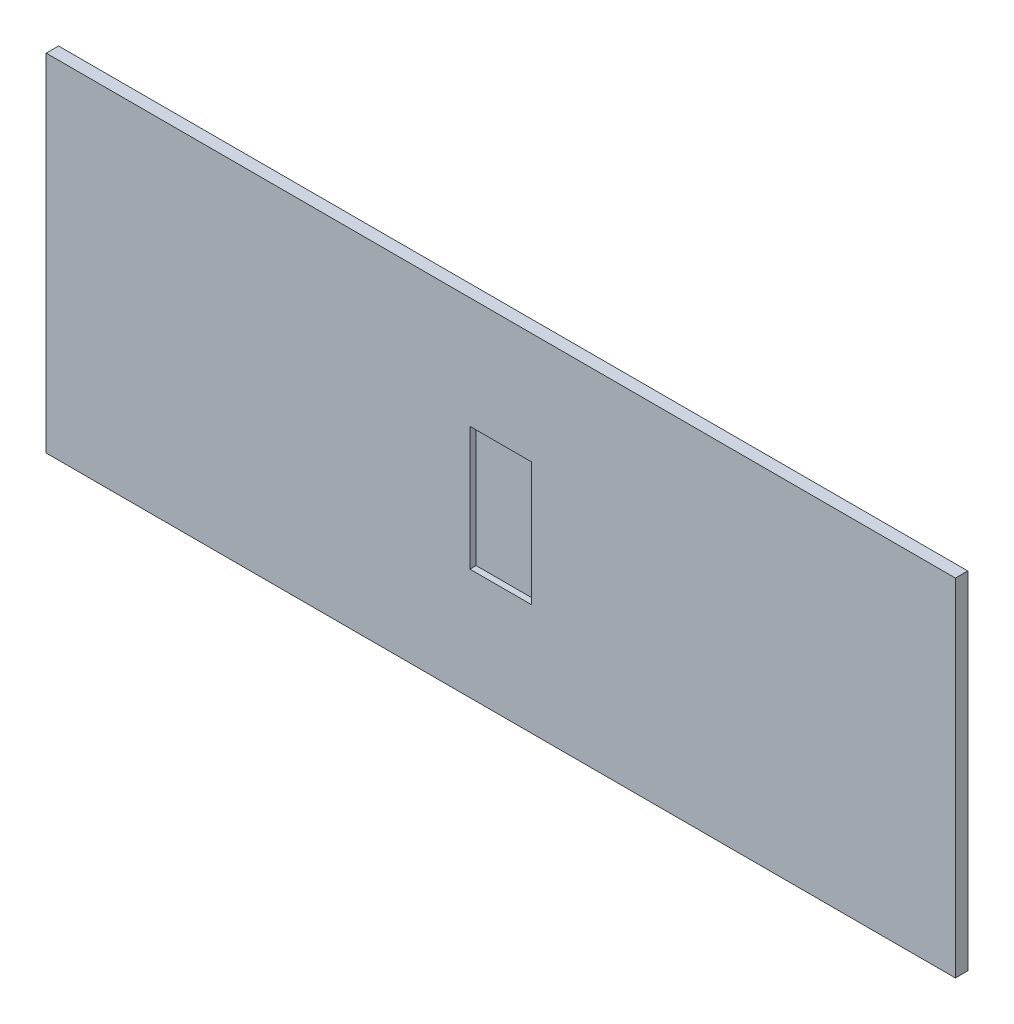
ISO-10303-21;
HEADER;
FILE_DESCRIPTION(('STEP AP214'),'2;1');
FILE_NAME('part.step','',(''),(''),'','','');
FILE_SCHEMA(('AUTOMOTIVE_DESIGN { 1 0 10303 214 1 1 1 1 }'));
ENDSEC;
DATA;
#1=APPLICATION_CONTEXT('core data for automotive mechanical design processes');
#2=APPLICATION_PROTOCOL_DEFINITION('international standard','automotive_design',2000,#1);
#3=PRODUCT_CONTEXT('',#1,'mechanical');
#4=PRODUCT('Part','Part','',(#3));
#5=PRODUCT_RELATED_PRODUCT_CATEGORY('part','',(#4));
#6=PRODUCT_DEFINITION_FORMATION('','',#4);
#7=PRODUCT_DEFINITION_CONTEXT('part definition',#1,'design');
#8=PRODUCT_DEFINITION('design','',#6,#7);
#9=PRODUCT_DEFINITION_SHAPE('','',#8);
#10=(LENGTH_UNIT() NAMED_UNIT(*) SI_UNIT(.MILLI.,.METRE.));
#11=(NAMED_UNIT(*) PLANE_ANGLE_UNIT() SI_UNIT($,.RADIAN.));
#12=(NAMED_UNIT(*) SI_UNIT($,.STERADIAN.) SOLID_ANGLE_UNIT());
#13=UNCERTAINTY_MEASURE_WITH_UNIT(LENGTH_MEASURE(1.E-05),#10,'distance_accuracy_value','');
#14=(GEOMETRIC_REPRESENTATION_CONTEXT(3) GLOBAL_UNCERTAINTY_ASSIGNED_CONTEXT((#13)) GLOBAL_UNIT_ASSIGNED_CONTEXT((#10,
#11,#12)) REPRESENTATION_CONTEXT('',''));
#15=CARTESIAN_POINT('',(0.,0.,0.));
#16=DIRECTION('',(0.,0.,1.));
#17=DIRECTION('',(1.,0.,0.));
#18=AXIS2_PLACEMENT_3D('',#15,#16,#17);
#19=CARTESIAN_POINT('',(73.5,-28.,1.));
#20=DIRECTION('',(-1.,0.,0.));
#21=DIRECTION('',(0.,0.,1.));
#22=AXIS2_PLACEMENT_3D('',#19,#20,#21);
#23=PLANE('',#22);
#24=DIRECTION('',(0.,1.,0.));
#25=VECTOR('',#24,1.);
#26=CARTESIAN_POINT('',(73.5,-28.,-1.));
#27=LINE('',#26,#25);
#28=CARTESIAN_POINT('',(73.5,-28.,-1.));
#29=VERTEX_POINT('',#28);
#30=CARTESIAN_POINT('',(73.5,28.,-1.));
#31=VERTEX_POINT('',#30);
#32=EDGE_CURVE('E162',#29,#31,#27,.T.);
#33=ORIENTED_EDGE('',*,*,#32,.T.);
#34=DIRECTION('',(0.,0.,-1.));
#35=VECTOR('',#34,1.);
#36=CARTESIAN_POINT('',(73.5,28.,1.));
#37=LINE('',#36,#35);
#38=CARTESIAN_POINT('',(73.5,28.,1.));
#39=VERTEX_POINT('',#38);
#40=EDGE_CURVE('E11',#39,#31,#37,.T.);
#41=ORIENTED_EDGE('',*,*,#40,.F.);
#42=DIRECTION('',(0.,1.,0.));
#43=VECTOR('',#42,1.);
#44=CARTESIAN_POINT('',(73.5,-28.,1.));
#45=LINE('',#44,#43);
#46=CARTESIAN_POINT('',(73.5,-28.,1.));
#47=VERTEX_POINT('',#46);
#48=EDGE_CURVE('E168',#47,#39,#45,.T.);
#49=ORIENTED_EDGE('',*,*,#48,.F.);
#50=DIRECTION('',(0.,0.,-1.));
#51=VECTOR('',#50,1.);
#52=CARTESIAN_POINT('',(73.5,-28.,1.));
#53=LINE('',#52,#51);
#54=EDGE_CURVE('E178',#47,#29,#53,.T.);
#55=ORIENTED_EDGE('',*,*,#54,.T.);
#56=EDGE_LOOP('',(#33,#41,#49,#55));
#57=FACE_BOUND('',#56,.T.);
#58=ADVANCED_FACE('F43',(#57),#23,.F.);
#59=CARTESIAN_POINT('',(-73.5,28.,1.));
#60=DIRECTION('',(0.,-1.,0.));
#61=DIRECTION('',(0.,0.,-1.));
#62=AXIS2_PLACEMENT_3D('',#59,#60,#61);
#63=PLANE('',#62);
#64=DIRECTION('',(-1.,0.,0.));
#65=VECTOR('',#64,1.);
#66=CARTESIAN_POINT('',(-73.5,28.,-1.));
#67=LINE('',#66,#65);
#68=CARTESIAN_POINT('',(-73.5,28.,-1.));
#69=VERTEX_POINT('',#68);
#70=EDGE_CURVE('E182',#31,#69,#67,.T.);
#71=ORIENTED_EDGE('',*,*,#70,.T.);
#72=DIRECTION('',(0.,0.,-1.));
#73=VECTOR('',#72,1.);
#74=CARTESIAN_POINT('',(-73.5,28.,1.));
#75=LINE('',#74,#73);
#76=CARTESIAN_POINT('',(-73.5,28.,1.));
#77=VERTEX_POINT('',#76);
#78=EDGE_CURVE('E51',#77,#69,#75,.T.);
#79=ORIENTED_EDGE('',*,*,#78,.F.);
#80=DIRECTION('',(-1.,0.,0.));
#81=VECTOR('',#80,1.);
#82=CARTESIAN_POINT('',(-73.5,28.,1.));
#83=LINE('',#82,#81);
#84=EDGE_CURVE('E95',#39,#77,#83,.T.);
#85=ORIENTED_EDGE('',*,*,#84,.F.);
#86=ORIENTED_EDGE('',*,*,#40,.T.);
#87=EDGE_LOOP('',(#71,#79,#85,#86));
#88=FACE_BOUND('',#87,.T.);
#89=ADVANCED_FACE('F217',(#88),#63,.F.);
#90=CARTESIAN_POINT('',(-73.5,-28.,1.));
#91=DIRECTION('',(1.,0.,0.));
#92=DIRECTION('',(0.,0.,-1.));
#93=AXIS2_PLACEMENT_3D('',#90,#91,#92);
#94=PLANE('',#93);
#95=DIRECTION('',(0.,-1.,0.));
#96=VECTOR('',#95,1.);
#97=CARTESIAN_POINT('',(-73.5,-28.,-1.));
#98=LINE('',#97,#96);
#99=CARTESIAN_POINT('',(-73.5,-28.,-1.));
#100=VERTEX_POINT('',#99);
#101=EDGE_CURVE('E185',#69,#100,#98,.T.);
#102=ORIENTED_EDGE('',*,*,#101,.T.);
#103=DIRECTION('',(0.,0.,-1.));
#104=VECTOR('',#103,1.);
#105=CARTESIAN_POINT('',(-73.5,-28.,1.));
#106=LINE('',#105,#104);
#107=CARTESIAN_POINT('',(-73.5,-28.,1.));
#108=VERTEX_POINT('',#107);
#109=EDGE_CURVE('E192',#108,#100,#106,.T.);
#110=ORIENTED_EDGE('',*,*,#109,.F.);
#111=DIRECTION('',(0.,-1.,0.));
#112=VECTOR('',#111,1.);
#113=CARTESIAN_POINT('',(-73.5,-28.,1.));
#114=LINE('',#113,#112);
#115=EDGE_CURVE('E173',#77,#108,#114,.T.);
#116=ORIENTED_EDGE('',*,*,#115,.F.);
#117=ORIENTED_EDGE('',*,*,#78,.T.);
#118=EDGE_LOOP('',(#102,#110,#116,#117));
#119=FACE_BOUND('',#118,.T.);
#120=ADVANCED_FACE('F199',(#119),#94,.F.);
#121=CARTESIAN_POINT('',(-73.5,-28.,1.));
#122=DIRECTION('',(0.,1.,0.));
#123=DIRECTION('',(0.,0.,1.));
#124=AXIS2_PLACEMENT_3D('',#121,#122,#123);
#125=PLANE('',#124);
#126=DIRECTION('',(1.,0.,0.));
#127=VECTOR('',#126,1.);
#128=CARTESIAN_POINT('',(-73.5,-28.,-1.));
#129=LINE('',#128,#127);
#130=EDGE_CURVE('E88',#100,#29,#129,.T.);
#131=ORIENTED_EDGE('',*,*,#130,.T.);
#132=ORIENTED_EDGE('',*,*,#54,.F.);
#133=DIRECTION('',(1.,0.,0.));
#134=VECTOR('',#133,1.);
#135=CARTESIAN_POINT('',(-73.5,-28.,1.));
#136=LINE('',#135,#134);
#137=EDGE_CURVE('E67',#108,#47,#136,.T.);
#138=ORIENTED_EDGE('',*,*,#137,.F.);
#139=ORIENTED_EDGE('',*,*,#109,.T.);
#140=EDGE_LOOP('',(#131,#132,#138,#139));
#141=FACE_BOUND('',#140,.T.);
#142=ADVANCED_FACE('F207',(#141),#125,.F.);
#143=CARTESIAN_POINT('',(0.,0.,1.));
#144=DIRECTION('',(0.,0.,-1.));
#145=DIRECTION('',(-1.,0.,0.));
#146=AXIS2_PLACEMENT_3D('',#143,#144,#145);
#147=PLANE('',#146);
#148=DIRECTION('',(-1.,0.,0.));
#149=VECTOR('',#148,1.);
#150=CARTESIAN_POINT('',(-5.,10.,1.));
#151=LINE('',#150,#149);
#152=CARTESIAN_POINT('',(5.,10.,1.));
#153=VERTEX_POINT('',#152);
#154=CARTESIAN_POINT('',(-5.,10.,1.));
#155=VERTEX_POINT('',#154);
#156=EDGE_CURVE('E153',#153,#155,#151,.T.);
#157=ORIENTED_EDGE('',*,*,#156,.F.);
#158=DIRECTION('',(0.,1.,0.));
#159=VECTOR('',#158,1.);
#160=CARTESIAN_POINT('',(5.,-10.,1.));
#161=LINE('',#160,#159);
#162=CARTESIAN_POINT('',(5.,-10.,1.));
#163=VERTEX_POINT('',#162);
#164=EDGE_CURVE('E58',#163,#153,#161,.T.);
#165=ORIENTED_EDGE('',*,*,#164,.F.);
#166=DIRECTION('',(1.,0.,0.));
#167=VECTOR('',#166,1.);
#168=CARTESIAN_POINT('',(-5.,-10.,1.));
#169=LINE('',#168,#167);
#170=CARTESIAN_POINT('',(-5.,-10.,1.));
#171=VERTEX_POINT('',#170);
#172=EDGE_CURVE('E140',#171,#163,#169,.T.);
#173=ORIENTED_EDGE('',*,*,#172,.F.);
#174=DIRECTION('',(0.,-1.,0.));
#175=VECTOR('',#174,1.);
#176=CARTESIAN_POINT('',(-5.,-10.,1.));
#177=LINE('',#176,#175);
#178=EDGE_CURVE('E144',#155,#171,#177,.T.);
#179=ORIENTED_EDGE('',*,*,#178,.F.);
#180=EDGE_LOOP('',(#157,#165,#173,#179));
#181=FACE_BOUND('',#180,.T.);
#182=ORIENTED_EDGE('',*,*,#48,.T.);
#183=ORIENTED_EDGE('',*,*,#84,.T.);
#184=ORIENTED_EDGE('',*,*,#115,.T.);
#185=ORIENTED_EDGE('',*,*,#137,.T.);
#186=EDGE_LOOP('',(#182,#183,#184,#185));
#187=FACE_BOUND('',#186,.T.);
#188=ADVANCED_FACE('F209',(#181,#187),#147,.F.);
#189=CARTESIAN_POINT('',(0.,0.,-1.));
#190=DIRECTION('',(0.,0.,-1.));
#191=DIRECTION('',(-1.,0.,0.));
#192=AXIS2_PLACEMENT_3D('',#189,#190,#191);
#193=PLANE('',#192);
#194=ORIENTED_EDGE('',*,*,#32,.F.);
#195=ORIENTED_EDGE('',*,*,#130,.F.);
#196=ORIENTED_EDGE('',*,*,#101,.F.);
#197=ORIENTED_EDGE('',*,*,#70,.F.);
#198=EDGE_LOOP('',(#194,#195,#196,#197));
#199=FACE_BOUND('',#198,.T.);
#200=ADVANCED_FACE('F203',(#199),#193,.T.);
#201=CARTESIAN_POINT('',(5.,-10.,0.));
#202=DIRECTION('',(1.,0.,0.));
#203=DIRECTION('',(0.,0.,-1.));
#204=AXIS2_PLACEMENT_3D('',#201,#202,#203);
#205=PLANE('',#204);
#206=ORIENTED_EDGE('',*,*,#164,.T.);
#207=DIRECTION('',(0.,0.,1.));
#208=VECTOR('',#207,1.);
#209=CARTESIAN_POINT('',(5.,10.,0.));
#210=LINE('',#209,#208);
#211=CARTESIAN_POINT('',(5.,10.,0.));
#212=VERTEX_POINT('',#211);
#213=EDGE_CURVE('E115',#212,#153,#210,.T.);
#214=ORIENTED_EDGE('',*,*,#213,.F.);
#215=DIRECTION('',(0.,1.,0.));
#216=VECTOR('',#215,1.);
#217=CARTESIAN_POINT('',(5.,-10.,0.));
#218=LINE('',#217,#216);
#219=CARTESIAN_POINT('',(5.,-10.,0.));
#220=VERTEX_POINT('',#219);
#221=EDGE_CURVE('E119',#220,#212,#218,.T.);
#222=ORIENTED_EDGE('',*,*,#221,.F.);
#223=DIRECTION('',(0.,0.,1.));
#224=VECTOR('',#223,1.);
#225=CARTESIAN_POINT('',(5.,-10.,0.));
#226=LINE('',#225,#224);
#227=EDGE_CURVE('E159',#220,#163,#226,.T.);
#228=ORIENTED_EDGE('',*,*,#227,.T.);
#229=EDGE_LOOP('',(#206,#214,#222,#228));
#230=FACE_BOUND('',#229,.T.);
#231=ADVANCED_FACE('F117',(#230),#205,.F.);
#232=CARTESIAN_POINT('',(-5.,-10.,0.));
#233=DIRECTION('',(0.,-1.,0.));
#234=DIRECTION('',(0.,0.,-1.));
#235=AXIS2_PLACEMENT_3D('',#232,#233,#234);
#236=PLANE('',#235);
#237=ORIENTED_EDGE('',*,*,#172,.T.);
#238=ORIENTED_EDGE('',*,*,#227,.F.);
#239=DIRECTION('',(1.,0.,0.));
#240=VECTOR('',#239,1.);
#241=CARTESIAN_POINT('',(-5.,-10.,0.));
#242=LINE('',#241,#240);
#243=CARTESIAN_POINT('',(-5.,-10.,0.));
#244=VERTEX_POINT('',#243);
#245=EDGE_CURVE('E126',#244,#220,#242,.T.);
#246=ORIENTED_EDGE('',*,*,#245,.F.);
#247=DIRECTION('',(0.,0.,1.));
#248=VECTOR('',#247,1.);
#249=CARTESIAN_POINT('',(-5.,-10.,0.));
#250=LINE('',#249,#248);
#251=EDGE_CURVE('E163',#244,#171,#250,.T.);
#252=ORIENTED_EDGE('',*,*,#251,.T.);
#253=EDGE_LOOP('',(#237,#238,#246,#252));
#254=FACE_BOUND('',#253,.T.);
#255=ADVANCED_FACE('F260',(#254),#236,.F.);
#256=CARTESIAN_POINT('',(-5.,-10.,0.));
#257=DIRECTION('',(-1.,0.,0.));
#258=DIRECTION('',(0.,0.,1.));
#259=AXIS2_PLACEMENT_3D('',#256,#257,#258);
#260=PLANE('',#259);
#261=ORIENTED_EDGE('',*,*,#178,.T.);
#262=ORIENTED_EDGE('',*,*,#251,.F.);
#263=DIRECTION('',(0.,-1.,0.));
#264=VECTOR('',#263,1.);
#265=CARTESIAN_POINT('',(-5.,-10.,0.));
#266=LINE('',#265,#264);
#267=CARTESIAN_POINT('',(-5.,10.,0.));
#268=VERTEX_POINT('',#267);
#269=EDGE_CURVE('E135',#268,#244,#266,.T.);
#270=ORIENTED_EDGE('',*,*,#269,.F.);
#271=DIRECTION('',(0.,0.,1.));
#272=VECTOR('',#271,1.);
#273=CARTESIAN_POINT('',(-5.,10.,0.));
#274=LINE('',#273,#272);
#275=EDGE_CURVE('E125',#268,#155,#274,.T.);
#276=ORIENTED_EDGE('',*,*,#275,.T.);
#277=EDGE_LOOP('',(#261,#262,#270,#276));
#278=FACE_BOUND('',#277,.T.);
#279=ADVANCED_FACE('F270',(#278),#260,.F.);
#280=CARTESIAN_POINT('',(-5.,10.,0.));
#281=DIRECTION('',(0.,1.,0.));
#282=DIRECTION('',(0.,0.,1.));
#283=AXIS2_PLACEMENT_3D('',#280,#281,#282);
#284=PLANE('',#283);
#285=ORIENTED_EDGE('',*,*,#156,.T.);
#286=ORIENTED_EDGE('',*,*,#275,.F.);
#287=DIRECTION('',(-1.,0.,0.));
#288=VECTOR('',#287,1.);
#289=CARTESIAN_POINT('',(-5.,10.,0.));
#290=LINE('',#289,#288);
#291=EDGE_CURVE('E129',#212,#268,#290,.T.);
#292=ORIENTED_EDGE('',*,*,#291,.F.);
#293=ORIENTED_EDGE('',*,*,#213,.T.);
#294=EDGE_LOOP('',(#285,#286,#292,#293));
#295=FACE_BOUND('',#294,.T.);
#296=ADVANCED_FACE('F130',(#295),#284,.F.);
#297=CARTESIAN_POINT('',(0.,0.,0.));
#298=DIRECTION('',(0.,0.,-1.));
#299=DIRECTION('',(-1.,0.,0.));
#300=AXIS2_PLACEMENT_3D('',#297,#298,#299);
#301=PLANE('',#300);
#302=ORIENTED_EDGE('',*,*,#221,.T.);
#303=ORIENTED_EDGE('',*,*,#291,.T.);
#304=ORIENTED_EDGE('',*,*,#269,.T.);
#305=ORIENTED_EDGE('',*,*,#245,.T.);
#306=EDGE_LOOP('',(#302,#303,#304,#305));
#307=FACE_BOUND('',#306,.T.);
#308=ADVANCED_FACE('F137',(#307),#301,.F.);
#309=CLOSED_SHELL('',(#58,#89,#120,#142,#188,#200,#231,#255,#279,#296,#308));
#310=MANIFOLD_SOLID_BREP('B2',#309);
#311=ADVANCED_BREP_SHAPE_REPRESENTATION('',(#18,#310),#14);
#312=SHAPE_DEFINITION_REPRESENTATION(#9,#311);
ENDSEC;
END-ISO-10303-21;
